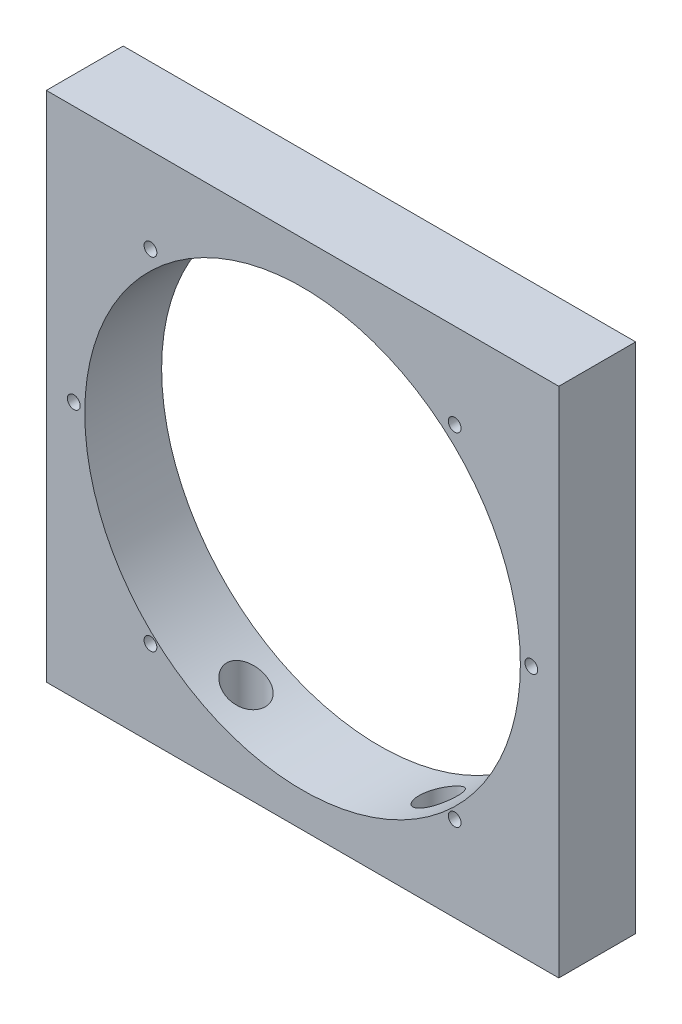
ISO-10303-21;
HEADER;
FILE_DESCRIPTION(('STEP AP214'),'2;1');
FILE_NAME('part.step','',(''),(''),'','','');
FILE_SCHEMA(('AUTOMOTIVE_DESIGN { 1 0 10303 214 1 1 1 1 }'));
ENDSEC;
DATA;
#1=APPLICATION_CONTEXT('core data for automotive mechanical design processes');
#2=APPLICATION_PROTOCOL_DEFINITION('international standard','automotive_design',2000,#1);
#3=PRODUCT_CONTEXT('',#1,'mechanical');
#4=PRODUCT('Part','Part','',(#3));
#5=PRODUCT_RELATED_PRODUCT_CATEGORY('part','',(#4));
#6=PRODUCT_DEFINITION_FORMATION('','',#4);
#7=PRODUCT_DEFINITION_CONTEXT('part definition',#1,'design');
#8=PRODUCT_DEFINITION('design','',#6,#7);
#9=PRODUCT_DEFINITION_SHAPE('','',#8);
#10=(LENGTH_UNIT() NAMED_UNIT(*) SI_UNIT(.MILLI.,.METRE.));
#11=(NAMED_UNIT(*) PLANE_ANGLE_UNIT() SI_UNIT($,.RADIAN.));
#12=(NAMED_UNIT(*) SI_UNIT($,.STERADIAN.) SOLID_ANGLE_UNIT());
#13=UNCERTAINTY_MEASURE_WITH_UNIT(LENGTH_MEASURE(1.E-05),#10,'distance_accuracy_value','');
#14=(GEOMETRIC_REPRESENTATION_CONTEXT(3) GLOBAL_UNCERTAINTY_ASSIGNED_CONTEXT((#13)) GLOBAL_UNIT_ASSIGNED_CONTEXT((#10,
#11,#12)) REPRESENTATION_CONTEXT('',''));
#15=CARTESIAN_POINT('',(0.,0.,0.));
#16=DIRECTION('',(0.,0.,1.));
#17=DIRECTION('',(1.,0.,0.));
#18=AXIS2_PLACEMENT_3D('',#15,#16,#17);
#19=CARTESIAN_POINT('',(20.,28.3211731561078,3.));
#20=DIRECTION('',(1.,0.,0.));
#21=DIRECTION('',(0.,1.,0.));
#22=AXIS2_PLACEMENT_3D('',#19,#20,#21);
#23=PLANE('',#22);
#24=DIRECTION('',(0.,-1.,0.));
#25=VECTOR('',#24,1.);
#26=CARTESIAN_POINT('',(20.,28.3211731561078,-3.));
#27=LINE('',#26,#25);
#28=CARTESIAN_POINT('',(20.,28.3211731561078,-3.));
#29=VERTEX_POINT('',#28);
#30=CARTESIAN_POINT('',(20.,-11.6788268438922,-3.));
#31=VERTEX_POINT('',#30);
#32=EDGE_CURVE('E117',#29,#31,#27,.T.);
#33=ORIENTED_EDGE('',*,*,#32,.F.);
#34=DIRECTION('',(0.,0.,-1.));
#35=VECTOR('',#34,1.);
#36=CARTESIAN_POINT('',(20.,28.3211731561078,3.));
#37=LINE('',#36,#35);
#38=CARTESIAN_POINT('',(20.,28.3211731561078,3.));
#39=VERTEX_POINT('',#38);
#40=EDGE_CURVE('E11',#39,#29,#37,.T.);
#41=ORIENTED_EDGE('',*,*,#40,.F.);
#42=DIRECTION('',(0.,-1.,0.));
#43=VECTOR('',#42,1.);
#44=CARTESIAN_POINT('',(20.,28.3211731561078,3.));
#45=LINE('',#44,#43);
#46=CARTESIAN_POINT('',(20.,-11.6788268438922,3.));
#47=VERTEX_POINT('',#46);
#48=EDGE_CURVE('E108',#39,#47,#45,.T.);
#49=ORIENTED_EDGE('',*,*,#48,.T.);
#50=DIRECTION('',(0.,0.,-1.));
#51=VECTOR('',#50,1.);
#52=CARTESIAN_POINT('',(20.,-11.6788268438922,3.));
#53=LINE('',#52,#51);
#54=EDGE_CURVE('E88',#47,#31,#53,.T.);
#55=ORIENTED_EDGE('',*,*,#54,.T.);
#56=EDGE_LOOP('',(#33,#41,#49,#55));
#57=FACE_BOUND('',#56,.T.);
#58=ADVANCED_FACE('F39',(#57),#23,.T.);
#59=CARTESIAN_POINT('',(-20.,28.3211731561078,3.));
#60=DIRECTION('',(0.,1.,0.));
#61=DIRECTION('',(-1.,0.,0.));
#62=AXIS2_PLACEMENT_3D('',#59,#60,#61);
#63=PLANE('',#62);
#64=DIRECTION('',(1.,0.,0.));
#65=VECTOR('',#64,1.);
#66=CARTESIAN_POINT('',(-20.,28.3211731561078,-3.));
#67=LINE('',#66,#65);
#68=CARTESIAN_POINT('',(-20.,28.3211731561078,-3.));
#69=VERTEX_POINT('',#68);
#70=EDGE_CURVE('E111',#69,#29,#67,.T.);
#71=ORIENTED_EDGE('',*,*,#70,.F.);
#72=DIRECTION('',(0.,0.,-1.));
#73=VECTOR('',#72,1.);
#74=CARTESIAN_POINT('',(-20.,28.3211731561078,3.));
#75=LINE('',#74,#73);
#76=CARTESIAN_POINT('',(-20.,28.3211731561078,3.));
#77=VERTEX_POINT('',#76);
#78=EDGE_CURVE('E54',#77,#69,#75,.T.);
#79=ORIENTED_EDGE('',*,*,#78,.F.);
#80=DIRECTION('',(1.,0.,0.));
#81=VECTOR('',#80,1.);
#82=CARTESIAN_POINT('',(-20.,28.3211731561078,3.));
#83=LINE('',#82,#81);
#84=EDGE_CURVE('E97',#77,#39,#83,.T.);
#85=ORIENTED_EDGE('',*,*,#84,.T.);
#86=ORIENTED_EDGE('',*,*,#40,.T.);
#87=EDGE_LOOP('',(#71,#79,#85,#86));
#88=FACE_BOUND('',#87,.T.);
#89=ADVANCED_FACE('F218',(#88),#63,.T.);
#90=CARTESIAN_POINT('',(-20.,28.3211731561078,3.));
#91=DIRECTION('',(1.,0.,0.));
#92=DIRECTION('',(0.,0.,-1.));
#93=AXIS2_PLACEMENT_3D('',#90,#91,#92);
#94=PLANE('',#93);
#95=DIRECTION('',(0.,-1.,0.));
#96=VECTOR('',#95,1.);
#97=CARTESIAN_POINT('',(-20.,28.3211731561078,-3.));
#98=LINE('',#97,#96);
#99=CARTESIAN_POINT('',(-20.,-11.6788268438922,-3.));
#100=VERTEX_POINT('',#99);
#101=EDGE_CURVE('E102',#69,#100,#98,.T.);
#102=ORIENTED_EDGE('',*,*,#101,.T.);
#103=DIRECTION('',(0.,0.,-1.));
#104=VECTOR('',#103,1.);
#105=CARTESIAN_POINT('',(-20.,-11.6788268438922,3.));
#106=LINE('',#105,#104);
#107=CARTESIAN_POINT('',(-20.,-11.6788268438922,3.));
#108=VERTEX_POINT('',#107);
#109=EDGE_CURVE('E100',#108,#100,#106,.T.);
#110=ORIENTED_EDGE('',*,*,#109,.F.);
#111=DIRECTION('',(0.,-1.,0.));
#112=VECTOR('',#111,1.);
#113=CARTESIAN_POINT('',(-20.,28.3211731561078,3.));
#114=LINE('',#113,#112);
#115=EDGE_CURVE('E93',#77,#108,#114,.T.);
#116=ORIENTED_EDGE('',*,*,#115,.F.);
#117=ORIENTED_EDGE('',*,*,#78,.T.);
#118=EDGE_LOOP('',(#102,#110,#116,#117));
#119=FACE_BOUND('',#118,.T.);
#120=ADVANCED_FACE('F101',(#119),#94,.F.);
#121=CARTESIAN_POINT('',(20.,-11.6788268438922,3.));
#122=DIRECTION('',(0.,-1.,0.));
#123=DIRECTION('',(1.,0.,0.));
#124=AXIS2_PLACEMENT_3D('',#121,#122,#123);
#125=PLANE('',#124);
#126=CARTESIAN_POINT('',(-7.5,-11.6788268438922,-0.0851450463853015));
#127=DIRECTION('',(0.,-1.,0.));
#128=DIRECTION('',(1.,0.,0.));
#129=AXIS2_PLACEMENT_3D('',#126,#127,#128);
#130=CIRCLE('',#129,1.5);
#131=CARTESIAN_POINT('',(-6.,-11.6788268438922,-0.0851450463853015));
#132=VERTEX_POINT('',#131);
#133=EDGE_CURVE('E161',#132,#132,#130,.T.);
#134=ORIENTED_EDGE('',*,*,#133,.F.);
#135=EDGE_LOOP('',(#134));
#136=FACE_BOUND('',#135,.T.);
#137=CARTESIAN_POINT('',(7.5,-11.6788268438922,-0.0851450463853034));
#138=DIRECTION('',(0.,-1.,0.));
#139=DIRECTION('',(1.,0.,0.));
#140=AXIS2_PLACEMENT_3D('',#137,#138,#139);
#141=CIRCLE('',#140,1.5);
#142=CARTESIAN_POINT('',(9.,-11.6788268438922,-0.0851450463853034));
#143=VERTEX_POINT('',#142);
#144=EDGE_CURVE('E158',#143,#143,#141,.T.);
#145=ORIENTED_EDGE('',*,*,#144,.F.);
#146=EDGE_LOOP('',(#145));
#147=FACE_BOUND('',#146,.T.);
#148=DIRECTION('',(-1.,0.,0.));
#149=VECTOR('',#148,1.);
#150=CARTESIAN_POINT('',(20.,-11.6788268438922,-3.));
#151=LINE('',#150,#149);
#152=EDGE_CURVE('E121',#31,#100,#151,.T.);
#153=ORIENTED_EDGE('',*,*,#152,.F.);
#154=ORIENTED_EDGE('',*,*,#54,.F.);
#155=DIRECTION('',(-1.,0.,0.));
#156=VECTOR('',#155,1.);
#157=CARTESIAN_POINT('',(20.,-11.6788268438922,3.));
#158=LINE('',#157,#156);
#159=EDGE_CURVE('E96',#47,#108,#158,.T.);
#160=ORIENTED_EDGE('',*,*,#159,.T.);
#161=ORIENTED_EDGE('',*,*,#109,.T.);
#162=EDGE_LOOP('',(#153,#154,#160,#161));
#163=FACE_BOUND('',#162,.T.);
#164=ADVANCED_FACE('F106',(#136,#147,#163),#125,.T.);
#165=CARTESIAN_POINT('',(0.,0.,3.));
#166=DIRECTION('',(0.,0.,-1.));
#167=DIRECTION('',(-1.,0.,0.));
#168=AXIS2_PLACEMENT_3D('',#165,#166,#167);
#169=PLANE('',#168);
#170=CARTESIAN_POINT('',(0.,8.01211427964432,3.));
#171=DIRECTION('',(0.,0.,1.));
#172=DIRECTION('',(1.,0.,0.));
#173=AXIS2_PLACEMENT_3D('',#170,#171,#172);
#174=CIRCLE('',#173,17.);
#175=CARTESIAN_POINT('',(17.,8.01211427964432,3.));
#176=VERTEX_POINT('',#175);
#177=EDGE_CURVE('E258',#176,#176,#174,.T.);
#178=ORIENTED_EDGE('',*,*,#177,.F.);
#179=EDGE_LOOP('',(#178));
#180=FACE_BOUND('',#179,.T.);
#181=CARTESIAN_POINT('',(-17.856475426545,8.32117315610778,3.));
#182=DIRECTION('',(0.,0.,1.));
#183=DIRECTION('',(1.,0.,0.));
#184=AXIS2_PLACEMENT_3D('',#181,#182,#183);
#185=CIRCLE('',#184,0.499999999999999);
#186=CARTESIAN_POINT('',(-17.356475426545,8.32117315610778,3.));
#187=VERTEX_POINT('',#186);
#188=EDGE_CURVE('E139',#187,#187,#185,.T.);
#189=ORIENTED_EDGE('',*,*,#188,.F.);
#190=EDGE_LOOP('',(#189));
#191=FACE_BOUND('',#190,.T.);
#192=CARTESIAN_POINT('',(11.8721782484545,21.659280154319,3.));
#193=DIRECTION('',(0.,0.,1.));
#194=DIRECTION('',(-1.,0.,0.));
#195=AXIS2_PLACEMENT_3D('',#192,#193,#194);
#196=CIRCLE('',#195,0.500000000000003);
#197=CARTESIAN_POINT('',(11.3721782484545,21.659280154319,3.));
#198=VERTEX_POINT('',#197);
#199=EDGE_CURVE('E165',#198,#198,#196,.T.);
#200=ORIENTED_EDGE('',*,*,#199,.F.);
#201=EDGE_LOOP('',(#200));
#202=FACE_BOUND('',#201,.T.);
#203=CARTESIAN_POINT('',(17.856475426545,8.32117315610778,3.));
#204=DIRECTION('',(0.,0.,1.));
#205=DIRECTION('',(-1.,0.,0.));
#206=AXIS2_PLACEMENT_3D('',#203,#204,#205);
#207=CIRCLE('',#206,0.499999999999999);
#208=CARTESIAN_POINT('',(17.356475426545,8.32117315610778,3.));
#209=VERTEX_POINT('',#208);
#210=EDGE_CURVE('E170',#209,#209,#207,.T.);
#211=ORIENTED_EDGE('',*,*,#210,.F.);
#212=EDGE_LOOP('',(#211));
#213=FACE_BOUND('',#212,.T.);
#214=CARTESIAN_POINT('',(11.8721782484545,-5.0169338421034,3.));
#215=DIRECTION('',(0.,0.,1.));
#216=DIRECTION('',(-1.,0.,0.));
#217=AXIS2_PLACEMENT_3D('',#214,#215,#216);
#218=CIRCLE('',#217,0.500000000000001);
#219=CARTESIAN_POINT('',(11.3721782484545,-5.0169338421034,3.));
#220=VERTEX_POINT('',#219);
#221=EDGE_CURVE('E176',#220,#220,#218,.T.);
#222=ORIENTED_EDGE('',*,*,#221,.F.);
#223=EDGE_LOOP('',(#222));
#224=FACE_BOUND('',#223,.T.);
#225=CARTESIAN_POINT('',(-11.8721782484545,-5.0169338421034,3.));
#226=DIRECTION('',(0.,0.,1.));
#227=DIRECTION('',(1.,0.,0.));
#228=AXIS2_PLACEMENT_3D('',#225,#226,#227);
#229=CIRCLE('',#228,0.500000000000001);
#230=CARTESIAN_POINT('',(-11.3721782484545,-5.0169338421034,3.));
#231=VERTEX_POINT('',#230);
#232=EDGE_CURVE('E184',#231,#231,#229,.T.);
#233=ORIENTED_EDGE('',*,*,#232,.F.);
#234=EDGE_LOOP('',(#233));
#235=FACE_BOUND('',#234,.T.);
#236=CARTESIAN_POINT('',(-11.8721782484545,21.659280154319,3.));
#237=DIRECTION('',(0.,0.,1.));
#238=DIRECTION('',(1.,0.,0.));
#239=AXIS2_PLACEMENT_3D('',#236,#237,#238);
#240=CIRCLE('',#239,0.499999999999999);
#241=CARTESIAN_POINT('',(-11.3721782484545,21.659280154319,3.));
#242=VERTEX_POINT('',#241);
#243=EDGE_CURVE('E180',#242,#242,#240,.T.);
#244=ORIENTED_EDGE('',*,*,#243,.F.);
#245=EDGE_LOOP('',(#244));
#246=FACE_BOUND('',#245,.T.);
#247=ORIENTED_EDGE('',*,*,#48,.F.);
#248=ORIENTED_EDGE('',*,*,#84,.F.);
#249=ORIENTED_EDGE('',*,*,#115,.T.);
#250=ORIENTED_EDGE('',*,*,#159,.F.);
#251=EDGE_LOOP('',(#247,#248,#249,#250));
#252=FACE_BOUND('',#251,.T.);
#253=ADVANCED_FACE('F95',(#180,#191,#202,#213,#224,#235,#246,#252),#169,.F.);
#254=CARTESIAN_POINT('',(0.,0.,-3.));
#255=DIRECTION('',(0.,0.,-1.));
#256=DIRECTION('',(-1.,0.,0.));
#257=AXIS2_PLACEMENT_3D('',#254,#255,#256);
#258=PLANE('',#257);
#259=CARTESIAN_POINT('',(0.,8.01211427964432,-3.));
#260=DIRECTION('',(0.,0.,1.));
#261=DIRECTION('',(1.,0.,0.));
#262=AXIS2_PLACEMENT_3D('',#259,#260,#261);
#263=CIRCLE('',#262,17.);
#264=CARTESIAN_POINT('',(17.,8.01211427964432,-3.));
#265=VERTEX_POINT('',#264);
#266=EDGE_CURVE('E272',#265,#265,#263,.T.);
#267=ORIENTED_EDGE('',*,*,#266,.T.);
#268=EDGE_LOOP('',(#267));
#269=FACE_BOUND('',#268,.T.);
#270=CARTESIAN_POINT('',(-17.856475426545,8.32117315610778,-3.));
#271=DIRECTION('',(0.,0.,-1.));
#272=DIRECTION('',(-1.,0.,0.));
#273=AXIS2_PLACEMENT_3D('',#270,#271,#272);
#274=CIRCLE('',#273,0.499999999999999);
#275=CARTESIAN_POINT('',(-18.356475426545,8.32117315610778,-3.));
#276=VERTEX_POINT('',#275);
#277=EDGE_CURVE('E122',#276,#276,#274,.T.);
#278=ORIENTED_EDGE('',*,*,#277,.F.);
#279=EDGE_LOOP('',(#278));
#280=FACE_BOUND('',#279,.T.);
#281=CARTESIAN_POINT('',(11.8721782484545,21.659280154319,-3.));
#282=DIRECTION('',(0.,0.,-1.));
#283=DIRECTION('',(-1.,0.,0.));
#284=AXIS2_PLACEMENT_3D('',#281,#282,#283);
#285=CIRCLE('',#284,0.500000000000003);
#286=CARTESIAN_POINT('',(11.3721782484545,21.659280154319,-3.));
#287=VERTEX_POINT('',#286);
#288=EDGE_CURVE('E151',#287,#287,#285,.T.);
#289=ORIENTED_EDGE('',*,*,#288,.F.);
#290=EDGE_LOOP('',(#289));
#291=FACE_BOUND('',#290,.T.);
#292=CARTESIAN_POINT('',(17.856475426545,8.32117315610778,-3.));
#293=DIRECTION('',(0.,0.,-1.));
#294=DIRECTION('',(-1.,0.,0.));
#295=AXIS2_PLACEMENT_3D('',#292,#293,#294);
#296=CIRCLE('',#295,0.499999999999999);
#297=CARTESIAN_POINT('',(17.356475426545,8.32117315610778,-3.));
#298=VERTEX_POINT('',#297);
#299=EDGE_CURVE('E147',#298,#298,#296,.T.);
#300=ORIENTED_EDGE('',*,*,#299,.F.);
#301=EDGE_LOOP('',(#300));
#302=FACE_BOUND('',#301,.T.);
#303=CARTESIAN_POINT('',(11.8721782484545,-5.0169338421034,-3.));
#304=DIRECTION('',(0.,0.,-1.));
#305=DIRECTION('',(-1.,0.,0.));
#306=AXIS2_PLACEMENT_3D('',#303,#304,#305);
#307=CIRCLE('',#306,0.500000000000001);
#308=CARTESIAN_POINT('',(11.3721782484545,-5.0169338421034,-3.));
#309=VERTEX_POINT('',#308);
#310=EDGE_CURVE('E143',#309,#309,#307,.T.);
#311=ORIENTED_EDGE('',*,*,#310,.F.);
#312=EDGE_LOOP('',(#311));
#313=FACE_BOUND('',#312,.T.);
#314=CARTESIAN_POINT('',(-11.8721782484545,-5.0169338421034,-3.));
#315=DIRECTION('',(0.,0.,-1.));
#316=DIRECTION('',(-1.,0.,0.));
#317=AXIS2_PLACEMENT_3D('',#314,#315,#316);
#318=CIRCLE('',#317,0.500000000000001);
#319=CARTESIAN_POINT('',(-12.3721782484545,-5.0169338421034,-3.));
#320=VERTEX_POINT('',#319);
#321=EDGE_CURVE('E138',#320,#320,#318,.T.);
#322=ORIENTED_EDGE('',*,*,#321,.F.);
#323=EDGE_LOOP('',(#322));
#324=FACE_BOUND('',#323,.T.);
#325=CARTESIAN_POINT('',(-11.8721782484545,21.659280154319,-3.));
#326=DIRECTION('',(0.,0.,-1.));
#327=DIRECTION('',(-1.,0.,0.));
#328=AXIS2_PLACEMENT_3D('',#325,#326,#327);
#329=CIRCLE('',#328,0.499999999999999);
#330=CARTESIAN_POINT('',(-12.3721782484545,21.659280154319,-3.));
#331=VERTEX_POINT('',#330);
#332=EDGE_CURVE('E134',#331,#331,#329,.T.);
#333=ORIENTED_EDGE('',*,*,#332,.F.);
#334=EDGE_LOOP('',(#333));
#335=FACE_BOUND('',#334,.T.);
#336=ORIENTED_EDGE('',*,*,#32,.T.);
#337=ORIENTED_EDGE('',*,*,#152,.T.);
#338=ORIENTED_EDGE('',*,*,#101,.F.);
#339=ORIENTED_EDGE('',*,*,#70,.T.);
#340=EDGE_LOOP('',(#336,#337,#338,#339));
#341=FACE_BOUND('',#340,.T.);
#342=ADVANCED_FACE('F196',(#269,#280,#291,#302,#313,#324,#335,#341),#258,.T.);
#343=CARTESIAN_POINT('',(-11.8721782484545,21.659280154319,-37.));
#344=DIRECTION('',(0.,0.,1.));
#345=DIRECTION('',(1.,0.,0.));
#346=AXIS2_PLACEMENT_3D('',#343,#344,#345);
#347=CYLINDRICAL_SURFACE('',#346,0.499999999999999);
#348=ORIENTED_EDGE('',*,*,#332,.T.);
#349=EDGE_LOOP('',(#348));
#350=FACE_BOUND('',#349,.T.);
#351=ORIENTED_EDGE('',*,*,#243,.T.);
#352=EDGE_LOOP('',(#351));
#353=FACE_BOUND('',#352,.T.);
#354=ADVANCED_FACE('F203',(#350,#353),#347,.F.);
#355=CARTESIAN_POINT('',(-11.8721782484545,-5.0169338421034,-37.));
#356=DIRECTION('',(0.,0.,1.));
#357=DIRECTION('',(1.,0.,0.));
#358=AXIS2_PLACEMENT_3D('',#355,#356,#357);
#359=CYLINDRICAL_SURFACE('',#358,0.500000000000001);
#360=ORIENTED_EDGE('',*,*,#321,.T.);
#361=EDGE_LOOP('',(#360));
#362=FACE_BOUND('',#361,.T.);
#363=ORIENTED_EDGE('',*,*,#232,.T.);
#364=EDGE_LOOP('',(#363));
#365=FACE_BOUND('',#364,.T.);
#366=ADVANCED_FACE('F205',(#362,#365),#359,.F.);
#367=CARTESIAN_POINT('',(11.8721782484545,-5.0169338421034,-37.));
#368=DIRECTION('',(0.,0.,1.));
#369=DIRECTION('',(1.,0.,0.));
#370=AXIS2_PLACEMENT_3D('',#367,#368,#369);
#371=CYLINDRICAL_SURFACE('',#370,0.500000000000001);
#372=ORIENTED_EDGE('',*,*,#310,.T.);
#373=EDGE_LOOP('',(#372));
#374=FACE_BOUND('',#373,.T.);
#375=ORIENTED_EDGE('',*,*,#221,.T.);
#376=EDGE_LOOP('',(#375));
#377=FACE_BOUND('',#376,.T.);
#378=ADVANCED_FACE('F192',(#374,#377),#371,.F.);
#379=CARTESIAN_POINT('',(17.856475426545,8.32117315610778,-37.));
#380=DIRECTION('',(0.,0.,1.));
#381=DIRECTION('',(1.,0.,0.));
#382=AXIS2_PLACEMENT_3D('',#379,#380,#381);
#383=CYLINDRICAL_SURFACE('',#382,0.499999999999999);
#384=ORIENTED_EDGE('',*,*,#299,.T.);
#385=EDGE_LOOP('',(#384));
#386=FACE_BOUND('',#385,.T.);
#387=ORIENTED_EDGE('',*,*,#210,.T.);
#388=EDGE_LOOP('',(#387));
#389=FACE_BOUND('',#388,.T.);
#390=ADVANCED_FACE('F295',(#386,#389),#383,.F.);
#391=CARTESIAN_POINT('',(11.8721782484545,21.659280154319,-37.));
#392=DIRECTION('',(0.,0.,1.));
#393=DIRECTION('',(1.,0.,0.));
#394=AXIS2_PLACEMENT_3D('',#391,#392,#393);
#395=CYLINDRICAL_SURFACE('',#394,0.500000000000003);
#396=ORIENTED_EDGE('',*,*,#288,.T.);
#397=EDGE_LOOP('',(#396));
#398=FACE_BOUND('',#397,.T.);
#399=ORIENTED_EDGE('',*,*,#199,.T.);
#400=EDGE_LOOP('',(#399));
#401=FACE_BOUND('',#400,.T.);
#402=ADVANCED_FACE('F247',(#398,#401),#395,.F.);
#403=CARTESIAN_POINT('',(-17.856475426545,8.32117315610778,-37.));
#404=DIRECTION('',(0.,0.,1.));
#405=DIRECTION('',(1.,0.,0.));
#406=AXIS2_PLACEMENT_3D('',#403,#404,#405);
#407=CYLINDRICAL_SURFACE('',#406,0.499999999999999);
#408=ORIENTED_EDGE('',*,*,#277,.T.);
#409=EDGE_LOOP('',(#408));
#410=FACE_BOUND('',#409,.T.);
#411=ORIENTED_EDGE('',*,*,#188,.T.);
#412=EDGE_LOOP('',(#411));
#413=FACE_BOUND('',#412,.T.);
#414=ADVANCED_FACE('F238',(#410,#413),#407,.F.);
#415=CARTESIAN_POINT('',(7.5,-30.,-0.0851450463853034));
#416=DIRECTION('',(0.,1.,0.));
#417=DIRECTION('',(0.,0.,1.));
#418=AXIS2_PLACEMENT_3D('',#415,#416,#417);
#419=CYLINDRICAL_SURFACE('',#418,1.5);
#420=CARTESIAN_POINT('',(7.5,-7.24403202274804,1.4148549536147));
#421=CARTESIAN_POINT('',(7.59434593585758,-7.19764940816783,1.41485202899546));
#422=CARTESIAN_POINT('',(7.68834661145516,-7.15034125845237,1.40593750252502));
#423=CARTESIAN_POINT('',(7.87298880714921,-7.05529687306351,1.37078829093887));
#424=CARTESIAN_POINT('',(7.96362348706211,-7.00755998694939,1.344520179217));
#425=CARTESIAN_POINT('',(8.1389805283493,-6.91326353118659,1.27521918728449));
#426=CARTESIAN_POINT('',(8.22370105942982,-6.86670432882176,1.23218114404791));
#427=CARTESIAN_POINT('',(8.38462633455871,-6.77661607003236,1.12997481348626));
#428=CARTESIAN_POINT('',(8.46083379080914,-6.73308605020893,1.07081168427521));
#429=CARTESIAN_POINT('',(8.59934454087355,-6.65272319069631,0.939649869543359));
#430=CARTESIAN_POINT('',(8.66205304827904,-6.61570421797975,0.868196938693174));
#431=CARTESIAN_POINT('',(8.77396625928456,-6.54885326599421,0.712458427104873));
#432=CARTESIAN_POINT('',(8.8231866722431,-6.51901293087753,0.628187954242447));
#433=CARTESIAN_POINT('',(8.89954699004725,-6.4723534169594,0.461240950826978));
#434=CARTESIAN_POINT('',(8.92875686754964,-6.45432805044412,0.379852217206524));
#435=CARTESIAN_POINT('',(8.97284260218654,-6.42702652523718,0.211907942521901));
#436=CARTESIAN_POINT('',(8.98773741679467,-6.41773879561665,0.125359396473791));
#437=CARTESIAN_POINT('',(9.00110919815913,-6.40940006977102,-0.0369032733094795));
#438=CARTESIAN_POINT('',(9.00163486166704,-6.40907169840085,-0.112390537632508));
#439=CARTESIAN_POINT('',(8.99139501703444,-6.41545839564989,-0.262281912113986));
#440=CARTESIAN_POINT('',(8.9806320095643,-6.42217190434937,-0.336686258459769));
#441=CARTESIAN_POINT('',(8.94910842167777,-6.44173567468671,-0.479073045142051));
#442=CARTESIAN_POINT('',(8.9287944569257,-6.45431159777552,-0.547194040749963));
#443=CARTESIAN_POINT('',(8.87929492940003,-6.48474612768887,-0.678858335744518));
#444=CARTESIAN_POINT('',(8.85010756379331,-6.502605808009,-0.742400701630085));
#445=CARTESIAN_POINT('',(8.78150534849153,-6.54422053890748,-0.868250365781472));
#446=CARTESIAN_POINT('',(8.74149369764901,-6.56831393571128,-0.930118675885667));
#447=CARTESIAN_POINT('',(8.65387960278309,-6.6204852107833,-1.04632389049112));
#448=CARTESIAN_POINT('',(8.60627356819832,-6.64856497307719,-1.10065720968327));
#449=CARTESIAN_POINT('',(8.49785494206968,-6.71170661336123,-1.20802872833123));
#450=CARTESIAN_POINT('',(8.43612683528037,-6.74719883006846,-1.25988916149312));
#451=CARTESIAN_POINT('',(8.30622357612992,-6.82069491896312,-1.35257517815856));
#452=CARTESIAN_POINT('',(8.23804491217072,-6.85870015577624,-1.39339470393833));
#453=CARTESIAN_POINT('',(8.08759297121631,-6.94111615242469,-1.4681381426639));
#454=CARTESIAN_POINT('',(8.0046378585111,-6.98571902826772,-1.50048430721613));
#455=CARTESIAN_POINT('',(7.83449626926125,-7.07529514191065,-1.55005819121965));
#456=CARTESIAN_POINT('',(7.74730799138082,-7.12026853049467,-1.56727941399782));
#457=CARTESIAN_POINT('',(7.56528099213244,-7.21212746817572,-1.58668595534966));
#458=CARTESIAN_POINT('',(7.47030424899867,-7.25895736299096,-1.58786664016773));
#459=CARTESIAN_POINT('',(7.28069373253013,-7.3502608075461,-1.5720719262146));
#460=CARTESIAN_POINT('',(7.1860599499197,-7.39473442146352,-1.55509702221036));
#461=CARTESIAN_POINT('',(7.00265116903404,-7.47894121099574,-1.50341338712049));
#462=CARTESIAN_POINT('',(6.91378809750777,-7.51876685917867,-1.46917176119468));
#463=CARTESIAN_POINT('',(6.74266056528666,-7.59382217627391,-1.38344378156813));
#464=CARTESIAN_POINT('',(6.66039262898586,-7.62905427218127,-1.3319665859694));
#465=CARTESIAN_POINT('',(6.51235304179991,-7.69123526258141,-1.21765213213807));
#466=CARTESIAN_POINT('',(6.44578195684073,-7.71862640252337,-1.15609192766758));
#467=CARTESIAN_POINT('',(6.32401910581825,-7.76797144487593,-1.02074064327135));
#468=CARTESIAN_POINT('',(6.26882062014192,-7.78992855958633,-0.946956832552617));
#469=CARTESIAN_POINT('',(6.1765780652834,-7.82619795712238,-0.796252564793624));
#470=CARTESIAN_POINT('',(6.13837376618107,-7.84100851766501,-0.720160841560809));
#471=CARTESIAN_POINT('',(6.07522532994954,-7.86531597742555,-0.561871132202017));
#472=CARTESIAN_POINT('',(6.05027589758004,-7.87481499865155,-0.479675599491743));
#473=CARTESIAN_POINT('',(6.01579532394396,-7.88790229174242,-0.316783038997419));
#474=CARTESIAN_POINT('',(6.00543932863234,-7.89180700884435,-0.236285055142651));
#475=CARTESIAN_POINT('',(5.99785655800424,-7.89466841460832,-0.0745911618593563));
#476=CARTESIAN_POINT('',(6.00062733511269,-7.89362602569153,0.00660461464298896));
#477=CARTESIAN_POINT('',(6.01896053504075,-7.88669709728181,0.165372793712238));
#478=CARTESIAN_POINT('',(6.03422016456268,-7.88092522070599,0.242985495146822));
#479=CARTESIAN_POINT('',(6.07655095755344,-7.86478834838945,0.394410298554728));
#480=CARTESIAN_POINT('',(6.10362211113332,-7.85442335649422,0.468222403709961));
#481=CARTESIAN_POINT('',(6.16890140770508,-7.82915731891548,0.610836413708989));
#482=CARTESIAN_POINT('',(6.20722113156053,-7.81421075697477,0.679579042067391));
#483=CARTESIAN_POINT('',(6.29350323619884,-7.78009781452345,0.809534768583251));
#484=CARTESIAN_POINT('',(6.3414665091101,-7.76093104358409,0.870747169271381));
#485=CARTESIAN_POINT('',(6.44759694696419,-7.71785391392113,0.986712665996447));
#486=CARTESIAN_POINT('',(6.50610491953476,-7.69377973117377,1.04109236895889));
#487=CARTESIAN_POINT('',(6.62994472689129,-7.64190560745634,1.13929596906238));
#488=CARTESIAN_POINT('',(6.69528013369301,-7.61410371402639,1.18311430060574));
#489=CARTESIAN_POINT('',(6.83555374224732,-7.55327813812833,1.26223705453037));
#490=CARTESIAN_POINT('',(6.91084368198667,-7.52002601101937,1.29674003324695));
#491=CARTESIAN_POINT('',(7.06477417045796,-7.45061767760071,1.35265801676083));
#492=CARTESIAN_POINT('',(7.14341190177241,-7.41446389142425,1.37408380285634));
#493=CARTESIAN_POINT('',(7.26869099133364,-7.3556677998773,1.3976527121362));
#494=CARTESIAN_POINT('',(7.31489754111341,-7.33372898709516,1.40411510498653));
#495=CARTESIAN_POINT('',(7.40743037903671,-7.28927822801181,1.41271686472215));
#496=CARTESIAN_POINT('',(7.45375666281322,-7.26676630235574,1.41485638710679));
#497=CARTESIAN_POINT('',(7.5,-7.24403202274804,1.4148549536147));
#498=B_SPLINE_CURVE_WITH_KNOTS('',3,(#420,#421,#422,#423,#424,#425,#426,#427,#428,#429,#430,
#431,#432,#433,#434,#435,#436,#437,#438,#439,#440,#441,#442,#443,#444,#445,#446,#447,#448,#449,
#450,#451,#452,#453,#454,#455,#456,#457,#458,#459,#460,#461,#462,#463,#464,#465,#466,#467,#468,
#469,#470,#471,#472,#473,#474,#475,#476,#477,#478,#479,#480,#481,#482,#483,#484,#485,#486,#487,
#488,#489,#490,#491,#492,#493,#494,#495,#496,#497),.UNSPECIFIED.,.T.,.F.,(4,2,2,2,2,2,2,2,2,2,2,
2,2,2,2,2,2,2,2,2,2,2,2,2,2,2,2,2,2,2,2,2,2,2,2,2,2,2,4),(0.,0.315203811300602,
0.631016547754805,0.946926591662236,1.26273570020489,1.56704656367976,1.87100148027728,
2.1343973383766,2.39744389806478,2.62275511791371,2.84801643728127,3.06365713360247,
3.27934167154695,3.51097946765842,3.74272710655044,4.00594453750678,4.26930609420013,
4.56677618195742,4.86437398075864,5.18053041821529,5.4966782401555,5.80469878539797,
6.11255592329392,6.39517816729946,6.67763293919867,6.9355605777037,7.19338509802304,
7.43595612818883,7.6784819311334,7.91529600065104,8.15210987190155,8.39135714783308,
8.63062656681351,8.87982377720056,9.12915202301493,9.39577567969548,9.66217922447426,
9.81668085027222,9.97117691834381),.UNSPECIFIED.);
#499=CARTESIAN_POINT('',(7.5,-7.24403202274804,1.4148549536147));
#500=VERTEX_POINT('',#499);
#501=EDGE_CURVE('E162',#500,#500,#498,.T.);
#502=ORIENTED_EDGE('',*,*,#501,.T.);
#503=EDGE_LOOP('',(#502));
#504=FACE_BOUND('',#503,.T.);
#505=ORIENTED_EDGE('',*,*,#144,.T.);
#506=EDGE_LOOP('',(#505));
#507=FACE_BOUND('',#506,.T.);
#508=ADVANCED_FACE('F235',(#504,#507),#419,.F.);
#509=CARTESIAN_POINT('',(-7.5,-30.,-0.0851450463853015));
#510=DIRECTION('',(0.,1.,0.));
#511=DIRECTION('',(0.,0.,1.));
#512=AXIS2_PLACEMENT_3D('',#509,#510,#511);
#513=CYLINDRICAL_SURFACE('',#512,1.5);
#514=CARTESIAN_POINT('',(-7.5,-7.24403202274804,1.4148549536147));
#515=CARTESIAN_POINT('',(-7.41093735752875,-7.2878150388791,1.41485324259851));
#516=CARTESIAN_POINT('',(-7.32146206505694,-7.33082499391505,1.40691454104661));
#517=CARTESIAN_POINT('',(-7.14413849234897,-7.41419083979937,1.37481454570815));
#518=CARTESIAN_POINT('',(-7.05629068720618,-7.45454596415831,1.3506485892427));
#519=CARTESIAN_POINT('',(-6.88471283794975,-7.5316821131876,1.28593262638885));
#520=CARTESIAN_POINT('',(-6.80099812747367,-7.56845026022306,1.24532610209913));
#521=CARTESIAN_POINT('',(-6.6411706204091,-7.63724432090057,1.14820162241074));
#522=CARTESIAN_POINT('',(-6.5650544825427,-7.66927232191684,1.09169070268556));
#523=CARTESIAN_POINT('',(-6.42885911180304,-7.72557353794294,0.96863898332084));
#524=CARTESIAN_POINT('',(-6.36801672789197,-7.75024097689283,0.903124433961403));
#525=CARTESIAN_POINT('',(-6.25830112250544,-7.79412399528483,0.761151652462264));
#526=CARTESIAN_POINT('',(-6.20942150261948,-7.81334249002785,0.684699305346471));
#527=CARTESIAN_POINT('',(-6.12933495472635,-7.84452327660961,0.529870612574768));
#528=CARTESIAN_POINT('',(-6.09700723958369,-7.85695147645134,0.452166539285613));
#529=CARTESIAN_POINT('',(-6.045711784859,-7.87656507803633,0.291843883130231));
#530=CARTESIAN_POINT('',(-6.02673930866499,-7.88375233858048,0.209227053923096));
#531=CARTESIAN_POINT('',(-6.0035962308702,-7.89250694957674,0.0460551419833063));
#532=CARTESIAN_POINT('',(-5.9987086370628,-7.89434656786855,-0.0343844691001213));
#533=CARTESIAN_POINT('',(-6.00187277799762,-7.89315298873423,-0.194966212390234));
#534=CARTESIAN_POINT('',(-6.00992261048786,-7.89012050767632,-0.275108386593942));
#535=CARTESIAN_POINT('',(-6.03839857463821,-7.87932887154894,-0.4314594567271));
#536=CARTESIAN_POINT('',(-6.05861996768243,-7.87164789767755,-0.507711262246496));
#537=CARTESIAN_POINT('',(-6.11049087336964,-7.85176505151388,-0.655587677314562));
#538=CARTESIAN_POINT('',(-6.14214068399762,-7.83956306134024,-0.727212166152996));
#539=CARTESIAN_POINT('',(-6.21633678138938,-7.81061500258369,-0.865175120762293));
#540=CARTESIAN_POINT('',(-6.25905814993224,-7.7937956363486,-0.931403818946013));
#541=CARTESIAN_POINT('',(-6.35361112877434,-7.75602485846669,-1.05565594234249));
#542=CARTESIAN_POINT('',(-6.40544426816502,-7.7350727532123,-1.11367798740222));
#543=CARTESIAN_POINT('',(-6.5191885368431,-7.68833570806175,-1.22291411743397));
#544=CARTESIAN_POINT('',(-6.58146240234512,-7.66236794083386,-1.27367156229079));
#545=CARTESIAN_POINT('',(-6.71216252334751,-7.60684588542261,-1.36406338484155));
#546=CARTESIAN_POINT('',(-6.78059055725263,-7.57729055965388,-1.40369453358225));
#547=CARTESIAN_POINT('',(-6.92684587373808,-7.5128861764705,-1.47386580182927));
#548=CARTESIAN_POINT('',(-7.00499438998145,-7.47780777394398,-1.5035248699897));
#549=CARTESIAN_POINT('',(-7.16393106484167,-7.40494591128277,-1.54935348785221));
#550=CARTESIAN_POINT('',(-7.24472019385568,-7.36716145048399,-1.56551801919758));
#551=CARTESIAN_POINT('',(-7.41384130713337,-7.28639724610694,-1.58528670774932));
#552=CARTESIAN_POINT('',(-7.50223140100811,-7.24324876390096,-1.58770809914943));
#553=CARTESIAN_POINT('',(-7.67751773502332,-7.15579035432796,-1.57719219422736));
#554=CARTESIAN_POINT('',(-7.7644133969768,-7.11147999346291,-1.56424908330715));
#555=CARTESIAN_POINT('',(-7.9402288117292,-7.01995843119994,-1.52211919758444));
#556=CARTESIAN_POINT('',(-8.02890903406614,-6.97274711151913,-1.49192507420478));
#557=CARTESIAN_POINT('',(-8.19986504541423,-6.87988647850276,-1.41517233089148));
#558=CARTESIAN_POINT('',(-8.28213750486217,-6.83423798404618,-1.36860527173886));
#559=CARTESIAN_POINT('',(-8.43763156957733,-6.74642025089413,-1.25981303848321));
#560=CARTESIAN_POINT('',(-8.51086145293391,-6.70424784193184,-1.19760234630377));
#561=CARTESIAN_POINT('',(-8.64541522334975,-6.62560628954601,-1.05846601524943));
#562=CARTESIAN_POINT('',(-8.70675777795191,-6.58912822169244,-0.981563830954609));
#563=CARTESIAN_POINT('',(-8.80113089465917,-6.53238148405016,-0.835262080732098));
#564=CARTESIAN_POINT('',(-8.83741576352328,-6.5103311502393,-0.768641196602799));
#565=CARTESIAN_POINT('',(-8.89991456213942,-6.47211388317002,-0.629257427429101));
#566=CARTESIAN_POINT('',(-8.92613575305096,-6.45594270841823,-0.556499017152277));
#567=CARTESIAN_POINT('',(-8.96729434050106,-6.43046967293669,-0.406294958963779));
#568=CARTESIAN_POINT('',(-8.98217804012021,-6.42120050627024,-0.328828859156747));
#569=CARTESIAN_POINT('',(-8.99955859363001,-6.41037013720465,-0.171986045683371));
#570=CARTESIAN_POINT('',(-9.00205930079866,-6.40880653702637,-0.0926099340916985));
#571=CARTESIAN_POINT('',(-8.99484396720066,-6.41330738267136,0.0587462561390475));
#572=CARTESIAN_POINT('',(-8.98612070745295,-6.41875195833264,0.130795324525346));
#573=CARTESIAN_POINT('',(-8.95860105639464,-6.43585188320963,0.27216298752937));
#574=CARTESIAN_POINT('',(-8.93980451491698,-6.44750732501357,0.341481541425519));
#575=CARTESIAN_POINT('',(-8.89275696940902,-6.47648946454677,0.47645716550306));
#576=CARTESIAN_POINT('',(-8.86440138489015,-6.49387884613973,0.542063925546817));
#577=CARTESIAN_POINT('',(-8.79943539577021,-6.53337913462641,0.66749148365802));
#578=CARTESIAN_POINT('',(-8.76282237629527,-6.55549153703683,0.727310440313939));
#579=CARTESIAN_POINT('',(-8.67820011833875,-6.60607710295944,0.846379022497377));
#580=CARTESIAN_POINT('',(-8.62938850375456,-6.6349786903576,0.904874666751451));
#581=CARTESIAN_POINT('',(-8.52460218701118,-6.69621138788442,1.01297415180357));
#582=CARTESIAN_POINT('',(-8.4686231260869,-6.72854458282483,1.06257253744178));
#583=CARTESIAN_POINT('',(-8.34251170207538,-6.800328809301,1.15876867165292));
#584=CARTESIAN_POINT('',(-8.27149794084095,-6.84013907156903,1.20394408268023));
#585=CARTESIAN_POINT('',(-8.12374917412557,-6.9214657810169,1.28156805539732));
#586=CARTESIAN_POINT('',(-8.04701335862321,-6.96298246938587,1.31401481111628));
#587=CARTESIAN_POINT('',(-7.89291339821267,-7.04475110691113,1.36465114435803));
#588=CARTESIAN_POINT('',(-7.81571856594846,-7.08498054466083,1.38339443640147));
#589=CARTESIAN_POINT('',(-7.65912614933015,-7.16502385146079,1.40849752069975));
#590=CARTESIAN_POINT('',(-7.57972841811548,-7.20483769255981,1.41485648530756));
#591=CARTESIAN_POINT('',(-7.5,-7.24403202274804,1.4148549536147));
#592=B_SPLINE_CURVE_WITH_KNOTS('',3,(#514,#515,#516,#517,#518,#519,#520,#521,#522,#523,#524,
#525,#526,#527,#528,#529,#530,#531,#532,#533,#534,#535,#536,#537,#538,#539,#540,#541,#542,#543,
#544,#545,#546,#547,#548,#549,#550,#551,#552,#553,#554,#555,#556,#557,#558,#559,#560,#561,#562,
#563,#564,#565,#566,#567,#568,#569,#570,#571,#572,#573,#574,#575,#576,#577,#578,#579,#580,#581,
#582,#583,#584,#585,#586,#587,#588,#589,#590,#591),.UNSPECIFIED.,.T.,.F.,(4,2,2,2,2,2,2,2,2,2,2,
2,2,2,2,2,2,2,2,2,2,2,2,2,2,2,2,2,2,2,2,2,2,2,2,2,2,2,4),(0.,0.297437098396387,
0.594959697850623,0.893513897638274,1.19193623217484,1.4686894149803,1.74529424833353,
1.99920909217767,2.25303383633272,2.4936874623314,2.73430570710756,2.97098538473729,
3.20767123400722,3.4483563716642,3.68908193851291,3.94128784158011,4.19356686163355,
4.46436746989149,4.73526873884339,5.02916732961122,5.32317717989645,5.63642280560925,
5.94983012701601,6.26294837627821,6.57557085590873,6.81159285553497,7.0474442386381,
7.28440583856182,7.52129369731786,7.73859978039173,7.9559091030378,8.17567751536424,
8.39551561949992,8.63901078476944,8.88265473727366,9.16084112843662,9.43906697506037,
9.70531333854538,9.97157749471678),.UNSPECIFIED.);
#593=CARTESIAN_POINT('',(-7.5,-7.24403202274804,1.4148549536147));
#594=VERTEX_POINT('',#593);
#595=EDGE_CURVE('E42',#594,#594,#592,.T.);
#596=ORIENTED_EDGE('',*,*,#595,.T.);
#597=EDGE_LOOP('',(#596));
#598=FACE_BOUND('',#597,.T.);
#599=ORIENTED_EDGE('',*,*,#133,.T.);
#600=EDGE_LOOP('',(#599));
#601=FACE_BOUND('',#600,.T.);
#602=ADVANCED_FACE('F237',(#598,#601),#513,.F.);
#603=CARTESIAN_POINT('',(0.,8.01211427964432,-3.));
#604=DIRECTION('',(0.,0.,1.));
#605=DIRECTION('',(1.,0.,0.));
#606=AXIS2_PLACEMENT_3D('',#603,#604,#605);
#607=CYLINDRICAL_SURFACE('',#606,17.);
#608=ORIENTED_EDGE('',*,*,#595,.F.);
#609=EDGE_LOOP('',(#608));
#610=FACE_BOUND('',#609,.T.);
#611=ORIENTED_EDGE('',*,*,#266,.F.);
#612=EDGE_LOOP('',(#611));
#613=FACE_BOUND('',#612,.T.);
#614=ORIENTED_EDGE('',*,*,#177,.T.);
#615=EDGE_LOOP('',(#614));
#616=FACE_BOUND('',#615,.T.);
#617=ORIENTED_EDGE('',*,*,#501,.F.);
#618=EDGE_LOOP('',(#617));
#619=FACE_BOUND('',#618,.T.);
#620=ADVANCED_FACE('F245',(#610,#613,#616,#619),#607,.F.);
#621=CLOSED_SHELL('',(#58,#89,#120,#164,#253,#342,#354,#366,#378,#390,#402,#414,#508,#602,#620));
#622=MANIFOLD_SOLID_BREP('B2',#621);
#623=ADVANCED_BREP_SHAPE_REPRESENTATION('',(#18,#622),#14);
#624=SHAPE_DEFINITION_REPRESENTATION(#9,#623);
ENDSEC;
END-ISO-10303-21;
